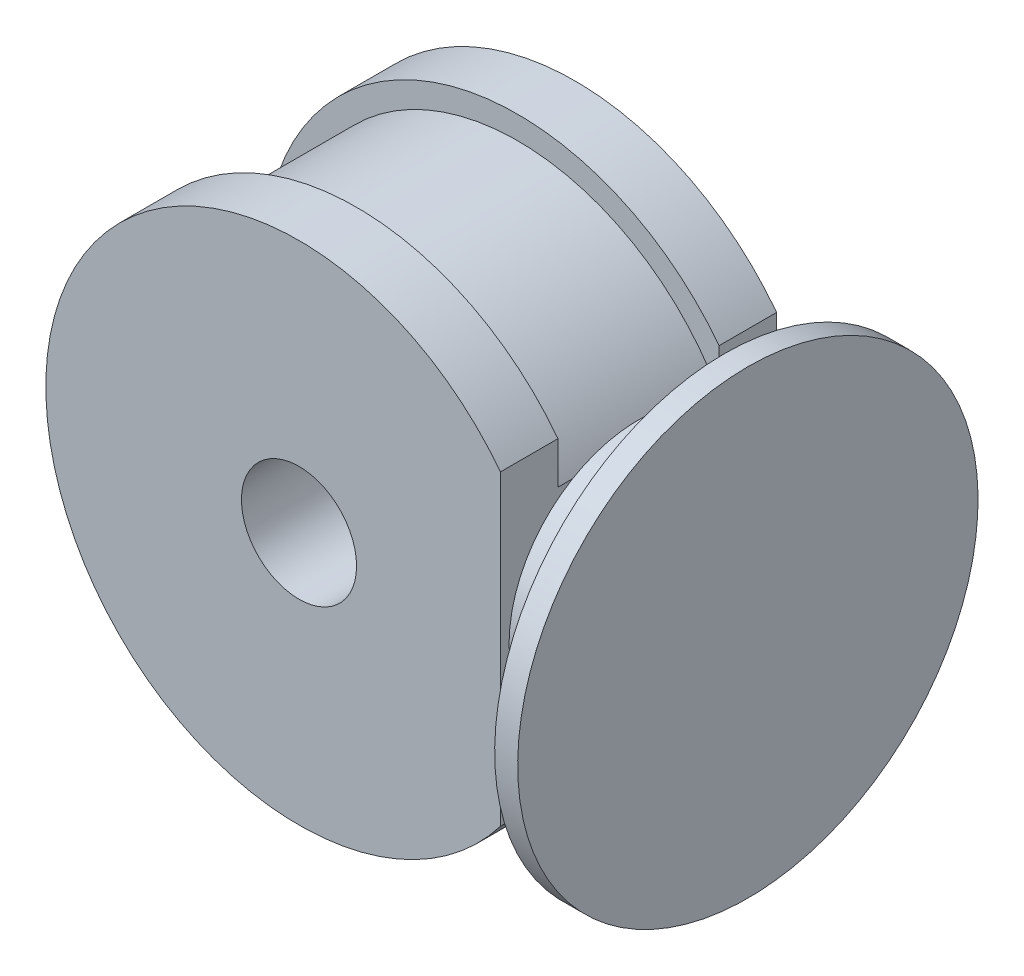
ISO-10303-21;
HEADER;
FILE_DESCRIPTION(('STEP AP214'),'2;1');
FILE_NAME('part.step','',(''),(''),'','','');
FILE_SCHEMA(('AUTOMOTIVE_DESIGN { 1 0 10303 214 1 1 1 1 }'));
ENDSEC;
DATA;
#1=APPLICATION_CONTEXT('core data for automotive mechanical design processes');
#2=APPLICATION_PROTOCOL_DEFINITION('international standard','automotive_design',2000,#1);
#3=PRODUCT_CONTEXT('',#1,'mechanical');
#4=PRODUCT('Part','Part','',(#3));
#5=PRODUCT_RELATED_PRODUCT_CATEGORY('part','',(#4));
#6=PRODUCT_DEFINITION_FORMATION('','',#4);
#7=PRODUCT_DEFINITION_CONTEXT('part definition',#1,'design');
#8=PRODUCT_DEFINITION('design','',#6,#7);
#9=PRODUCT_DEFINITION_SHAPE('','',#8);
#10=(LENGTH_UNIT() NAMED_UNIT(*) SI_UNIT(.MILLI.,.METRE.));
#11=(NAMED_UNIT(*) PLANE_ANGLE_UNIT() SI_UNIT($,.RADIAN.));
#12=(NAMED_UNIT(*) SI_UNIT($,.STERADIAN.) SOLID_ANGLE_UNIT());
#13=UNCERTAINTY_MEASURE_WITH_UNIT(LENGTH_MEASURE(1.E-05),#10,'distance_accuracy_value','');
#14=(GEOMETRIC_REPRESENTATION_CONTEXT(3) GLOBAL_UNCERTAINTY_ASSIGNED_CONTEXT((#13)) GLOBAL_UNIT_ASSIGNED_CONTEXT((#10,
#11,#12)) REPRESENTATION_CONTEXT('',''));
#15=CARTESIAN_POINT('',(0.,0.,0.));
#16=DIRECTION('',(0.,0.,1.));
#17=DIRECTION('',(1.,0.,0.));
#18=AXIS2_PLACEMENT_3D('',#15,#16,#17);
#19=CARTESIAN_POINT('',(35.,44.0697477523933,0.));
#20=DIRECTION('',(-1.,0.,0.));
#21=DIRECTION('',(0.,-1.,0.));
#22=AXIS2_PLACEMENT_3D('',#19,#20,#21);
#23=PLANE('',#22);
#24=CARTESIAN_POINT('',(35.,0.,24.));
#25=DIRECTION('',(-1.,0.,0.));
#26=DIRECTION('',(0.,-1.,0.));
#27=AXIS2_PLACEMENT_3D('',#24,#25,#26);
#28=CIRCLE('',#27,22.5);
#29=CARTESIAN_POINT('',(35.,-19.3649167310371,12.5435607626104));
#30=VERTEX_POINT('',#29);
#31=CARTESIAN_POINT('',(35.,19.3649167310371,12.5435607626104));
#32=VERTEX_POINT('',#31);
#33=EDGE_CURVE('E11',#30,#32,#28,.F.);
#34=ORIENTED_EDGE('',*,*,#33,.F.);
#35=DIRECTION('',(0.,0.,-1.));
#36=VECTOR('',#35,1.);
#37=CARTESIAN_POINT('',(35.,-19.3649167310371,38.));
#38=LINE('',#37,#36);
#39=CARTESIAN_POINT('',(35.,-19.3649167310371,10.));
#40=VERTEX_POINT('',#39);
#41=EDGE_CURVE('E101',#40,#30,#38,.F.);
#42=ORIENTED_EDGE('',*,*,#41,.F.);
#43=DIRECTION('',(0.,-1.,0.));
#44=VECTOR('',#43,1.);
#45=CARTESIAN_POINT('',(35.,0.,10.));
#46=LINE('',#45,#44);
#47=CARTESIAN_POINT('',(35.,-26.6645832519468,10.));
#48=VERTEX_POINT('',#47);
#49=EDGE_CURVE('E230',#40,#48,#46,.T.);
#50=ORIENTED_EDGE('',*,*,#49,.T.);
#51=DIRECTION('',(0.,0.,-1.));
#52=VECTOR('',#51,1.);
#53=CARTESIAN_POINT('',(35.,-26.6645832519468,10.));
#54=LINE('',#53,#52);
#55=CARTESIAN_POINT('',(35.,-26.6645832519468,0.));
#56=VERTEX_POINT('',#55);
#57=EDGE_CURVE('E228',#56,#48,#54,.F.);
#58=ORIENTED_EDGE('',*,*,#57,.F.);
#59=DIRECTION('',(0.,-1.,0.));
#60=VECTOR('',#59,1.);
#61=CARTESIAN_POINT('',(35.,44.0697477523933,0.));
#62=LINE('',#61,#60);
#63=CARTESIAN_POINT('',(35.,26.6645832519468,0.));
#64=VERTEX_POINT('',#63);
#65=EDGE_CURVE('E193',#64,#56,#62,.T.);
#66=ORIENTED_EDGE('',*,*,#65,.F.);
#67=DIRECTION('',(0.,0.,-1.));
#68=VECTOR('',#67,1.);
#69=CARTESIAN_POINT('',(35.,26.6645832519468,10.));
#70=LINE('',#69,#68);
#71=CARTESIAN_POINT('',(35.,26.6645832519468,10.));
#72=VERTEX_POINT('',#71);
#73=EDGE_CURVE('E218',#72,#64,#70,.T.);
#74=ORIENTED_EDGE('',*,*,#73,.F.);
#75=CARTESIAN_POINT('',(35.,19.3649167310371,10.));
#76=VERTEX_POINT('',#75);
#77=EDGE_CURVE('E222',#72,#76,#46,.T.);
#78=ORIENTED_EDGE('',*,*,#77,.T.);
#79=DIRECTION('',(0.,0.,-1.));
#80=VECTOR('',#79,1.);
#81=CARTESIAN_POINT('',(35.,19.3649167310371,38.));
#82=LINE('',#81,#80);
#83=EDGE_CURVE('E51',#32,#76,#82,.T.);
#84=ORIENTED_EDGE('',*,*,#83,.F.);
#85=EDGE_LOOP('',(#34,#42,#50,#58,#66,#74,#78,#84));
#86=FACE_BOUND('',#85,.T.);
#87=ADVANCED_FACE('F33',(#86),#23,.F.);
#88=CARTESIAN_POINT('',(35.,0.,24.));
#89=DIRECTION('',(1.,0.,0.));
#90=DIRECTION('',(0.,1.,0.));
#91=AXIS2_PLACEMENT_3D('',#88,#89,#90);
#92=CIRCLE('',#91,22.5);
#93=CARTESIAN_POINT('',(35.,19.3649167310371,35.4564392373896));
#94=VERTEX_POINT('',#93);
#95=CARTESIAN_POINT('',(35.,-19.3649167310371,35.4564392373896));
#96=VERTEX_POINT('',#95);
#97=EDGE_CURVE('E109',#94,#96,#92,.T.);
#98=ORIENTED_EDGE('',*,*,#97,.F.);
#99=CARTESIAN_POINT('',(35.,19.3649167310371,38.));
#100=VERTEX_POINT('',#99);
#101=EDGE_CURVE('E223',#100,#94,#82,.T.);
#102=ORIENTED_EDGE('',*,*,#101,.F.);
#103=DIRECTION('',(0.,-1.,0.));
#104=VECTOR('',#103,1.);
#105=CARTESIAN_POINT('',(35.,0.,38.));
#106=LINE('',#105,#104);
#107=CARTESIAN_POINT('',(35.,26.6645832519468,38.));
#108=VERTEX_POINT('',#107);
#109=EDGE_CURVE('E227',#108,#100,#106,.T.);
#110=ORIENTED_EDGE('',*,*,#109,.F.);
#111=DIRECTION('',(0.,0.,-1.));
#112=VECTOR('',#111,1.);
#113=CARTESIAN_POINT('',(35.,26.6645832519468,48.));
#114=LINE('',#113,#112);
#115=CARTESIAN_POINT('',(35.,26.6645832519468,48.));
#116=VERTEX_POINT('',#115);
#117=EDGE_CURVE('E208',#116,#108,#114,.T.);
#118=ORIENTED_EDGE('',*,*,#117,.F.);
#119=DIRECTION('',(0.,-1.,0.));
#120=VECTOR('',#119,1.);
#121=CARTESIAN_POINT('',(35.,0.,48.));
#122=LINE('',#121,#120);
#123=CARTESIAN_POINT('',(35.,-26.6645832519468,48.));
#124=VERTEX_POINT('',#123);
#125=EDGE_CURVE('E41',#116,#124,#122,.T.);
#126=ORIENTED_EDGE('',*,*,#125,.T.);
#127=DIRECTION('',(0.,0.,-1.));
#128=VECTOR('',#127,1.);
#129=CARTESIAN_POINT('',(35.,-26.6645832519468,48.));
#130=LINE('',#129,#128);
#131=CARTESIAN_POINT('',(35.,-26.6645832519468,38.));
#132=VERTEX_POINT('',#131);
#133=EDGE_CURVE('E206',#132,#124,#130,.F.);
#134=ORIENTED_EDGE('',*,*,#133,.F.);
#135=CARTESIAN_POINT('',(35.,-19.3649167310371,38.));
#136=VERTEX_POINT('',#135);
#137=EDGE_CURVE('E112',#136,#132,#106,.T.);
#138=ORIENTED_EDGE('',*,*,#137,.F.);
#139=EDGE_CURVE('E98',#96,#136,#38,.F.);
#140=ORIENTED_EDGE('',*,*,#139,.F.);
#141=EDGE_LOOP('',(#98,#102,#110,#118,#126,#134,#138,#140));
#142=FACE_BOUND('',#141,.T.);
#143=ADVANCED_FACE('F107',(#142),#23,.F.);
#144=CARTESIAN_POINT('',(0.,0.,10.));
#145=DIRECTION('',(0.,0.,1.));
#146=DIRECTION('',(1.,0.,0.));
#147=AXIS2_PLACEMENT_3D('',#144,#145,#146);
#148=PLANE('',#147);
#149=ORIENTED_EDGE('',*,*,#77,.F.);
#150=CARTESIAN_POINT('',(0.,0.,10.));
#151=DIRECTION('',(0.,0.,1.));
#152=DIRECTION('',(1.,0.,0.));
#153=AXIS2_PLACEMENT_3D('',#150,#151,#152);
#154=CIRCLE('',#153,44.);
#155=EDGE_CURVE('E196',#72,#48,#154,.T.);
#156=ORIENTED_EDGE('',*,*,#155,.T.);
#157=ORIENTED_EDGE('',*,*,#49,.F.);
#158=CARTESIAN_POINT('',(0.,0.,10.));
#159=DIRECTION('',(0.,0.,1.));
#160=DIRECTION('',(1.,0.,0.));
#161=AXIS2_PLACEMENT_3D('',#158,#159,#160);
#162=CIRCLE('',#161,40.);
#163=EDGE_CURVE('E201',#76,#40,#162,.T.);
#164=ORIENTED_EDGE('',*,*,#163,.F.);
#165=EDGE_LOOP('',(#149,#156,#157,#164));
#166=FACE_BOUND('',#165,.T.);
#167=ADVANCED_FACE('F159',(#166),#148,.T.);
#168=CARTESIAN_POINT('',(0.,0.,10.));
#169=DIRECTION('',(0.,0.,-1.));
#170=DIRECTION('',(-1.,0.,0.));
#171=AXIS2_PLACEMENT_3D('',#168,#169,#170);
#172=CYLINDRICAL_SURFACE('',#171,44.);
#173=ORIENTED_EDGE('',*,*,#155,.F.);
#174=ORIENTED_EDGE('',*,*,#73,.T.);
#175=CARTESIAN_POINT('',(0.,0.,0.));
#176=DIRECTION('',(0.,0.,1.));
#177=DIRECTION('',(1.,0.,0.));
#178=AXIS2_PLACEMENT_3D('',#175,#176,#177);
#179=CIRCLE('',#178,44.);
#180=EDGE_CURVE('E192',#64,#56,#179,.T.);
#181=ORIENTED_EDGE('',*,*,#180,.T.);
#182=ORIENTED_EDGE('',*,*,#57,.T.);
#183=EDGE_LOOP('',(#173,#174,#181,#182));
#184=FACE_BOUND('',#183,.T.);
#185=ADVANCED_FACE('F35',(#184),#172,.T.);
#186=CARTESIAN_POINT('',(0.,0.,0.));
#187=DIRECTION('',(0.,0.,1.));
#188=DIRECTION('',(1.,0.,0.));
#189=AXIS2_PLACEMENT_3D('',#186,#187,#188);
#190=PLANE('',#189);
#191=CARTESIAN_POINT('',(0.,0.,0.));
#192=DIRECTION('',(0.,0.,1.));
#193=DIRECTION('',(1.,0.,0.));
#194=AXIS2_PLACEMENT_3D('',#191,#192,#193);
#195=CIRCLE('',#194,10.);
#196=CARTESIAN_POINT('',(10.,0.,0.));
#197=VERTEX_POINT('',#196);
#198=EDGE_CURVE('E188',#197,#197,#195,.T.);
#199=ORIENTED_EDGE('',*,*,#198,.T.);
#200=EDGE_LOOP('',(#199));
#201=FACE_BOUND('',#200,.T.);
#202=ORIENTED_EDGE('',*,*,#180,.F.);
#203=ORIENTED_EDGE('',*,*,#65,.T.);
#204=EDGE_LOOP('',(#202,#203));
#205=FACE_BOUND('',#204,.T.);
#206=ADVANCED_FACE('F176',(#201,#205),#190,.F.);
#207=CARTESIAN_POINT('',(0.,0.,38.));
#208=DIRECTION('',(0.,0.,-1.));
#209=DIRECTION('',(-1.,0.,0.));
#210=AXIS2_PLACEMENT_3D('',#207,#208,#209);
#211=CYLINDRICAL_SURFACE('',#210,40.);
#212=CARTESIAN_POINT('',(0.,0.,38.));
#213=DIRECTION('',(0.,0.,1.));
#214=DIRECTION('',(1.,0.,0.));
#215=AXIS2_PLACEMENT_3D('',#212,#213,#214);
#216=CIRCLE('',#215,40.);
#217=EDGE_CURVE('E197',#100,#136,#216,.T.);
#218=ORIENTED_EDGE('',*,*,#217,.F.);
#219=ORIENTED_EDGE('',*,*,#101,.T.);
#220=EDGE_CURVE('E225',#94,#32,#82,.T.);
#221=ORIENTED_EDGE('',*,*,#220,.T.);
#222=ORIENTED_EDGE('',*,*,#83,.T.);
#223=ORIENTED_EDGE('',*,*,#163,.T.);
#224=ORIENTED_EDGE('',*,*,#41,.T.);
#225=EDGE_CURVE('E94',#30,#96,#38,.F.);
#226=ORIENTED_EDGE('',*,*,#225,.T.);
#227=ORIENTED_EDGE('',*,*,#139,.T.);
#228=EDGE_LOOP('',(#218,#219,#221,#222,#223,#224,#226,#227));
#229=FACE_BOUND('',#228,.T.);
#230=ADVANCED_FACE('F97',(#229),#211,.T.);
#231=CARTESIAN_POINT('',(0.,0.,38.));
#232=DIRECTION('',(0.,0.,1.));
#233=DIRECTION('',(1.,0.,0.));
#234=AXIS2_PLACEMENT_3D('',#231,#232,#233);
#235=PLANE('',#234);
#236=CARTESIAN_POINT('',(0.,0.,38.));
#237=DIRECTION('',(0.,0.,1.));
#238=DIRECTION('',(1.,0.,0.));
#239=AXIS2_PLACEMENT_3D('',#236,#237,#238);
#240=CIRCLE('',#239,44.);
#241=EDGE_CURVE('E215',#108,#132,#240,.T.);
#242=ORIENTED_EDGE('',*,*,#241,.F.);
#243=ORIENTED_EDGE('',*,*,#109,.T.);
#244=ORIENTED_EDGE('',*,*,#217,.T.);
#245=ORIENTED_EDGE('',*,*,#137,.T.);
#246=EDGE_LOOP('',(#242,#243,#244,#245));
#247=FACE_BOUND('',#246,.T.);
#248=ADVANCED_FACE('F167',(#247),#235,.F.);
#249=CARTESIAN_POINT('',(0.,0.,48.));
#250=DIRECTION('',(0.,0.,-1.));
#251=DIRECTION('',(-1.,0.,0.));
#252=AXIS2_PLACEMENT_3D('',#249,#250,#251);
#253=CYLINDRICAL_SURFACE('',#252,44.);
#254=CARTESIAN_POINT('',(0.,0.,48.));
#255=DIRECTION('',(0.,0.,1.));
#256=DIRECTION('',(1.,0.,0.));
#257=AXIS2_PLACEMENT_3D('',#254,#255,#256);
#258=CIRCLE('',#257,44.);
#259=EDGE_CURVE('E213',#116,#124,#258,.T.);
#260=ORIENTED_EDGE('',*,*,#259,.F.);
#261=ORIENTED_EDGE('',*,*,#117,.T.);
#262=ORIENTED_EDGE('',*,*,#241,.T.);
#263=ORIENTED_EDGE('',*,*,#133,.T.);
#264=EDGE_LOOP('',(#260,#261,#262,#263));
#265=FACE_BOUND('',#264,.T.);
#266=ADVANCED_FACE('F165',(#265),#253,.T.);
#267=CARTESIAN_POINT('',(0.,0.,48.));
#268=DIRECTION('',(0.,0.,1.));
#269=DIRECTION('',(1.,0.,0.));
#270=AXIS2_PLACEMENT_3D('',#267,#268,#269);
#271=PLANE('',#270);
#272=CARTESIAN_POINT('',(0.,0.,48.));
#273=DIRECTION('',(0.,0.,1.));
#274=DIRECTION('',(1.,0.,0.));
#275=AXIS2_PLACEMENT_3D('',#272,#273,#274);
#276=CIRCLE('',#275,10.);
#277=CARTESIAN_POINT('',(10.,0.,48.));
#278=VERTEX_POINT('',#277);
#279=EDGE_CURVE('E124',#278,#278,#276,.T.);
#280=ORIENTED_EDGE('',*,*,#279,.F.);
#281=EDGE_LOOP('',(#280));
#282=FACE_BOUND('',#281,.T.);
#283=ORIENTED_EDGE('',*,*,#125,.F.);
#284=ORIENTED_EDGE('',*,*,#259,.T.);
#285=EDGE_LOOP('',(#283,#284));
#286=FACE_BOUND('',#285,.T.);
#287=ADVANCED_FACE('F162',(#282,#286),#271,.T.);
#288=CARTESIAN_POINT('',(0.,0.,0.));
#289=DIRECTION('',(0.,0.,1.));
#290=DIRECTION('',(1.,0.,0.));
#291=AXIS2_PLACEMENT_3D('',#288,#289,#290);
#292=CYLINDRICAL_SURFACE('',#291,10.);
#293=ORIENTED_EDGE('',*,*,#198,.F.);
#294=EDGE_LOOP('',(#293));
#295=FACE_BOUND('',#294,.T.);
#296=ORIENTED_EDGE('',*,*,#279,.T.);
#297=EDGE_LOOP('',(#296));
#298=FACE_BOUND('',#297,.T.);
#299=ADVANCED_FACE('F161',(#295,#298),#292,.F.);
#300=CARTESIAN_POINT('',(35.,0.,24.));
#301=DIRECTION('',(1.,0.,0.));
#302=DIRECTION('',(0.,1.,0.));
#303=AXIS2_PLACEMENT_3D('',#300,#301,#302);
#304=PLANE('',#303);
#305=EDGE_CURVE('E114',#96,#30,#92,.T.);
#306=ORIENTED_EDGE('',*,*,#305,.F.);
#307=ORIENTED_EDGE('',*,*,#225,.F.);
#308=EDGE_LOOP('',(#306,#307));
#309=FACE_BOUND('',#308,.T.);
#310=ADVANCED_FACE('F115',(#309),#304,.F.);
#311=EDGE_CURVE('E117',#32,#94,#92,.T.);
#312=ORIENTED_EDGE('',*,*,#311,.F.);
#313=ORIENTED_EDGE('',*,*,#220,.F.);
#314=EDGE_LOOP('',(#312,#313));
#315=FACE_BOUND('',#314,.T.);
#316=ADVANCED_FACE('F146',(#315),#304,.F.);
#317=CARTESIAN_POINT('',(50.,0.,24.));
#318=DIRECTION('',(-1.,0.,0.));
#319=DIRECTION('',(0.,-1.,0.));
#320=AXIS2_PLACEMENT_3D('',#317,#318,#319);
#321=CYLINDRICAL_SURFACE('',#320,22.5);
#322=CARTESIAN_POINT('',(50.,0.,24.));
#323=DIRECTION('',(1.,0.,0.));
#324=DIRECTION('',(0.,1.,0.));
#325=AXIS2_PLACEMENT_3D('',#322,#323,#324);
#326=CIRCLE('',#325,22.5);
#327=CARTESIAN_POINT('',(50.,22.5,24.));
#328=VERTEX_POINT('',#327);
#329=EDGE_CURVE('E122',#328,#328,#326,.T.);
#330=ORIENTED_EDGE('',*,*,#329,.F.);
#331=EDGE_LOOP('',(#330));
#332=FACE_BOUND('',#331,.T.);
#333=ORIENTED_EDGE('',*,*,#97,.T.);
#334=ORIENTED_EDGE('',*,*,#305,.T.);
#335=ORIENTED_EDGE('',*,*,#33,.T.);
#336=ORIENTED_EDGE('',*,*,#311,.T.);
#337=EDGE_LOOP('',(#333,#334,#335,#336));
#338=FACE_BOUND('',#337,.T.);
#339=ADVANCED_FACE('F120',(#332,#338),#321,.T.);
#340=CARTESIAN_POINT('',(50.,0.,24.));
#341=DIRECTION('',(1.,0.,0.));
#342=DIRECTION('',(0.,1.,0.));
#343=AXIS2_PLACEMENT_3D('',#340,#341,#342);
#344=PLANE('',#343);
#345=CARTESIAN_POINT('',(50.,0.,24.));
#346=DIRECTION('',(1.,0.,0.));
#347=DIRECTION('',(0.,1.,0.));
#348=AXIS2_PLACEMENT_3D('',#345,#346,#347);
#349=CIRCLE('',#348,40.);
#350=CARTESIAN_POINT('',(50.,40.,24.));
#351=VERTEX_POINT('',#350);
#352=EDGE_CURVE('E129',#351,#351,#349,.T.);
#353=ORIENTED_EDGE('',*,*,#352,.F.);
#354=EDGE_LOOP('',(#353));
#355=FACE_BOUND('',#354,.T.);
#356=ORIENTED_EDGE('',*,*,#329,.T.);
#357=EDGE_LOOP('',(#356));
#358=FACE_BOUND('',#357,.T.);
#359=ADVANCED_FACE('F139',(#355,#358),#344,.F.);
#360=CARTESIAN_POINT('',(54.,0.,24.));
#361=DIRECTION('',(-1.,0.,0.));
#362=DIRECTION('',(0.,-1.,0.));
#363=AXIS2_PLACEMENT_3D('',#360,#361,#362);
#364=CYLINDRICAL_SURFACE('',#363,40.);
#365=CARTESIAN_POINT('',(54.,0.,24.));
#366=DIRECTION('',(1.,0.,0.));
#367=DIRECTION('',(0.,1.,0.));
#368=AXIS2_PLACEMENT_3D('',#365,#366,#367);
#369=CIRCLE('',#368,40.);
#370=CARTESIAN_POINT('',(54.,40.,24.));
#371=VERTEX_POINT('',#370);
#372=EDGE_CURVE('E127',#371,#371,#369,.T.);
#373=ORIENTED_EDGE('',*,*,#372,.F.);
#374=EDGE_LOOP('',(#373));
#375=FACE_BOUND('',#374,.T.);
#376=ORIENTED_EDGE('',*,*,#352,.T.);
#377=EDGE_LOOP('',(#376));
#378=FACE_BOUND('',#377,.T.);
#379=ADVANCED_FACE('F137',(#375,#378),#364,.T.);
#380=CARTESIAN_POINT('',(54.,0.,24.));
#381=DIRECTION('',(1.,0.,0.));
#382=DIRECTION('',(0.,1.,0.));
#383=AXIS2_PLACEMENT_3D('',#380,#381,#382);
#384=PLANE('',#383);
#385=ORIENTED_EDGE('',*,*,#372,.T.);
#386=EDGE_LOOP('',(#385));
#387=FACE_BOUND('',#386,.T.);
#388=ADVANCED_FACE('F246',(#387),#384,.T.);
#389=CLOSED_SHELL('',(#87,#143,#167,#185,#206,#230,#248,#266,#287,#299,#310,#316,#339,#359,#379,#388));
#390=MANIFOLD_SOLID_BREP('B2',#389);
#391=ADVANCED_BREP_SHAPE_REPRESENTATION('',(#18,#390),#14);
#392=SHAPE_DEFINITION_REPRESENTATION(#9,#391);
ENDSEC;
END-ISO-10303-21;
